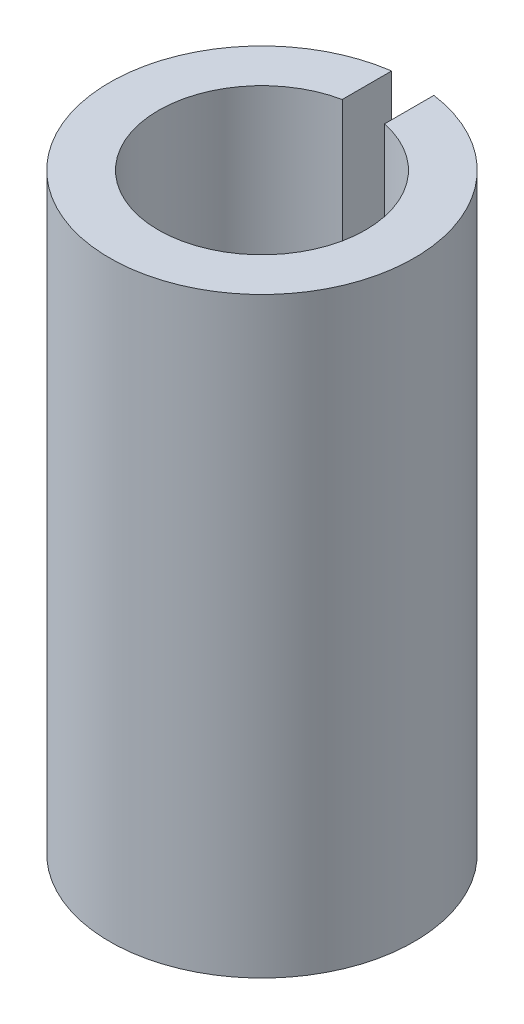
ISO-10303-21;
HEADER;
FILE_DESCRIPTION(('STEP AP214'),'2;1');
FILE_NAME('part.step','',(''),(''),'','','');
FILE_SCHEMA(('AUTOMOTIVE_DESIGN { 1 0 10303 214 1 1 1 1 }'));
ENDSEC;
DATA;
#1=APPLICATION_CONTEXT('core data for automotive mechanical design processes');
#2=APPLICATION_PROTOCOL_DEFINITION('international standard','automotive_design',2000,#1);
#3=PRODUCT_CONTEXT('',#1,'mechanical');
#4=PRODUCT('Part','Part','',(#3));
#5=PRODUCT_RELATED_PRODUCT_CATEGORY('part','',(#4));
#6=PRODUCT_DEFINITION_FORMATION('','',#4);
#7=PRODUCT_DEFINITION_CONTEXT('part definition',#1,'design');
#8=PRODUCT_DEFINITION('design','',#6,#7);
#9=PRODUCT_DEFINITION_SHAPE('','',#8);
#10=(LENGTH_UNIT() NAMED_UNIT(*) SI_UNIT(.MILLI.,.METRE.));
#11=(NAMED_UNIT(*) PLANE_ANGLE_UNIT() SI_UNIT($,.RADIAN.));
#12=(NAMED_UNIT(*) SI_UNIT($,.STERADIAN.) SOLID_ANGLE_UNIT());
#13=UNCERTAINTY_MEASURE_WITH_UNIT(LENGTH_MEASURE(1.E-05),#10,'distance_accuracy_value','');
#14=(GEOMETRIC_REPRESENTATION_CONTEXT(3) GLOBAL_UNCERTAINTY_ASSIGNED_CONTEXT((#13)) GLOBAL_UNIT_ASSIGNED_CONTEXT((#10,
#11,#12)) REPRESENTATION_CONTEXT('',''));
#15=CARTESIAN_POINT('',(0.,0.,0.));
#16=DIRECTION('',(0.,0.,1.));
#17=DIRECTION('',(1.,0.,0.));
#18=AXIS2_PLACEMENT_3D('',#15,#16,#17);
#19=CARTESIAN_POINT('',(0.,7.,0.));
#20=DIRECTION('',(0.,1.,0.));
#21=DIRECTION('',(0.,0.,1.));
#22=AXIS2_PLACEMENT_3D('',#19,#20,#21);
#23=PLANE('',#22);
#24=DIRECTION('',(0.,0.,-1.));
#25=VECTOR('',#24,1.);
#26=CARTESIAN_POINT('',(0.25,7.,-2.98807649043868));
#27=LINE('',#26,#25);
#28=CARTESIAN_POINT('',(0.25,7.,-1.19921849552115));
#29=VERTEX_POINT('',#28);
#30=CARTESIAN_POINT('',(0.25,7.,-1.78255434699759));
#31=VERTEX_POINT('',#30);
#32=EDGE_CURVE('E75',#29,#31,#27,.T.);
#33=ORIENTED_EDGE('',*,*,#32,.F.);
#34=CARTESIAN_POINT('',(0.,7.,0.));
#35=DIRECTION('',(0.,1.,0.));
#36=DIRECTION('',(0.,0.,1.));
#37=AXIS2_PLACEMENT_3D('',#34,#35,#36);
#38=CIRCLE('',#37,1.225);
#39=CARTESIAN_POINT('',(-0.25,7.,-1.19921849552115));
#40=VERTEX_POINT('',#39);
#41=EDGE_CURVE('E84',#40,#29,#38,.T.);
#42=ORIENTED_EDGE('',*,*,#41,.F.);
#43=DIRECTION('',(0.,0.,1.));
#44=VECTOR('',#43,1.);
#45=CARTESIAN_POINT('',(-0.25,7.,-2.98807649043868));
#46=LINE('',#45,#44);
#47=CARTESIAN_POINT('',(-0.25,7.,-1.78255434699759));
#48=VERTEX_POINT('',#47);
#49=EDGE_CURVE('E58',#48,#40,#46,.T.);
#50=ORIENTED_EDGE('',*,*,#49,.F.);
#51=CARTESIAN_POINT('',(0.,7.,0.));
#52=DIRECTION('',(0.,1.,0.));
#53=DIRECTION('',(0.,0.,1.));
#54=AXIS2_PLACEMENT_3D('',#51,#52,#53);
#55=CIRCLE('',#54,1.8);
#56=EDGE_CURVE('E86',#48,#31,#55,.T.);
#57=ORIENTED_EDGE('',*,*,#56,.T.);
#58=EDGE_LOOP('',(#33,#42,#50,#57));
#59=FACE_BOUND('',#58,.T.);
#60=ADVANCED_FACE('F36',(#59),#23,.T.);
#61=CARTESIAN_POINT('',(0.,0.,0.));
#62=DIRECTION('',(0.,1.,0.));
#63=DIRECTION('',(0.,0.,1.));
#64=AXIS2_PLACEMENT_3D('',#61,#62,#63);
#65=PLANE('',#64);
#66=CARTESIAN_POINT('',(0.,0.,0.));
#67=DIRECTION('',(0.,1.,0.));
#68=DIRECTION('',(0.,0.,1.));
#69=AXIS2_PLACEMENT_3D('',#66,#67,#68);
#70=CIRCLE('',#69,1.225);
#71=CARTESIAN_POINT('',(-0.25,0.,-1.19921849552115));
#72=VERTEX_POINT('',#71);
#73=CARTESIAN_POINT('',(0.25,0.,-1.19921849552115));
#74=VERTEX_POINT('',#73);
#75=EDGE_CURVE('E90',#72,#74,#70,.T.);
#76=ORIENTED_EDGE('',*,*,#75,.T.);
#77=DIRECTION('',(0.,0.,-1.));
#78=VECTOR('',#77,1.);
#79=CARTESIAN_POINT('',(0.25,0.,-2.98807649043868));
#80=LINE('',#79,#78);
#81=CARTESIAN_POINT('',(0.25,0.,-1.78255434699759));
#82=VERTEX_POINT('',#81);
#83=EDGE_CURVE('E50',#74,#82,#80,.T.);
#84=ORIENTED_EDGE('',*,*,#83,.T.);
#85=CARTESIAN_POINT('',(0.,0.,0.));
#86=DIRECTION('',(0.,1.,0.));
#87=DIRECTION('',(0.,0.,1.));
#88=AXIS2_PLACEMENT_3D('',#85,#86,#87);
#89=CIRCLE('',#88,1.8);
#90=CARTESIAN_POINT('',(-0.25,0.,-1.78255434699759));
#91=VERTEX_POINT('',#90);
#92=EDGE_CURVE('E89',#91,#82,#89,.T.);
#93=ORIENTED_EDGE('',*,*,#92,.F.);
#94=DIRECTION('',(0.,0.,1.));
#95=VECTOR('',#94,1.);
#96=CARTESIAN_POINT('',(-0.25,0.,-2.98807649043868));
#97=LINE('',#96,#95);
#98=EDGE_CURVE('E101',#91,#72,#97,.T.);
#99=ORIENTED_EDGE('',*,*,#98,.T.);
#100=EDGE_LOOP('',(#76,#84,#93,#99));
#101=FACE_BOUND('',#100,.T.);
#102=ADVANCED_FACE('F105',(#101),#65,.F.);
#103=CARTESIAN_POINT('',(0.,7.,0.));
#104=DIRECTION('',(0.,-1.,0.));
#105=DIRECTION('',(0.,0.,-1.));
#106=AXIS2_PLACEMENT_3D('',#103,#104,#105);
#107=CYLINDRICAL_SURFACE('',#106,1.8);
#108=ORIENTED_EDGE('',*,*,#92,.T.);
#109=DIRECTION('',(0.,-1.,0.));
#110=VECTOR('',#109,1.);
#111=CARTESIAN_POINT('',(0.25,7.,-1.78255434699759));
#112=LINE('',#111,#110);
#113=EDGE_CURVE('E94',#82,#31,#112,.F.);
#114=ORIENTED_EDGE('',*,*,#113,.T.);
#115=ORIENTED_EDGE('',*,*,#56,.F.);
#116=DIRECTION('',(0.,-1.,0.));
#117=VECTOR('',#116,1.);
#118=CARTESIAN_POINT('',(-0.25,7.,-1.78255434699759));
#119=LINE('',#118,#117);
#120=EDGE_CURVE('E106',#48,#91,#119,.T.);
#121=ORIENTED_EDGE('',*,*,#120,.T.);
#122=EDGE_LOOP('',(#108,#114,#115,#121));
#123=FACE_BOUND('',#122,.T.);
#124=ADVANCED_FACE('F38',(#123),#107,.T.);
#125=CARTESIAN_POINT('',(0.,7.,0.));
#126=DIRECTION('',(0.,-1.,0.));
#127=DIRECTION('',(0.,0.,-1.));
#128=AXIS2_PLACEMENT_3D('',#125,#126,#127);
#129=CYLINDRICAL_SURFACE('',#128,1.225);
#130=DIRECTION('',(0.,-1.,0.));
#131=VECTOR('',#130,1.);
#132=CARTESIAN_POINT('',(0.25,7.,-1.19921849552115));
#133=LINE('',#132,#131);
#134=EDGE_CURVE('E11',#74,#29,#133,.F.);
#135=ORIENTED_EDGE('',*,*,#134,.F.);
#136=ORIENTED_EDGE('',*,*,#75,.F.);
#137=DIRECTION('',(0.,-1.,0.));
#138=VECTOR('',#137,1.);
#139=CARTESIAN_POINT('',(-0.25,7.,-1.19921849552115));
#140=LINE('',#139,#138);
#141=EDGE_CURVE('E44',#40,#72,#140,.T.);
#142=ORIENTED_EDGE('',*,*,#141,.F.);
#143=ORIENTED_EDGE('',*,*,#41,.T.);
#144=EDGE_LOOP('',(#135,#136,#142,#143));
#145=FACE_BOUND('',#144,.T.);
#146=ADVANCED_FACE('F88',(#145),#129,.F.);
#147=CARTESIAN_POINT('',(-0.25,0.,-2.98807649043868));
#148=DIRECTION('',(-1.,0.,0.));
#149=DIRECTION('',(0.,0.,1.));
#150=AXIS2_PLACEMENT_3D('',#147,#148,#149);
#151=PLANE('',#150);
#152=ORIENTED_EDGE('',*,*,#49,.T.);
#153=ORIENTED_EDGE('',*,*,#141,.T.);
#154=ORIENTED_EDGE('',*,*,#98,.F.);
#155=ORIENTED_EDGE('',*,*,#120,.F.);
#156=EDGE_LOOP('',(#152,#153,#154,#155));
#157=FACE_BOUND('',#156,.T.);
#158=ADVANCED_FACE('F100',(#157),#151,.F.);
#159=CARTESIAN_POINT('',(0.25,0.,-2.98807649043868));
#160=DIRECTION('',(1.,0.,0.));
#161=DIRECTION('',(0.,0.,-1.));
#162=AXIS2_PLACEMENT_3D('',#159,#160,#161);
#163=PLANE('',#162);
#164=ORIENTED_EDGE('',*,*,#83,.F.);
#165=ORIENTED_EDGE('',*,*,#134,.T.);
#166=ORIENTED_EDGE('',*,*,#32,.T.);
#167=ORIENTED_EDGE('',*,*,#113,.F.);
#168=EDGE_LOOP('',(#164,#165,#166,#167));
#169=FACE_BOUND('',#168,.T.);
#170=ADVANCED_FACE('F74',(#169),#163,.F.);
#171=CLOSED_SHELL('',(#60,#102,#124,#146,#158,#170));
#172=MANIFOLD_SOLID_BREP('B2',#171);
#173=ADVANCED_BREP_SHAPE_REPRESENTATION('',(#18,#172),#14);
#174=SHAPE_DEFINITION_REPRESENTATION(#9,#173);
ENDSEC;
END-ISO-10303-21;
